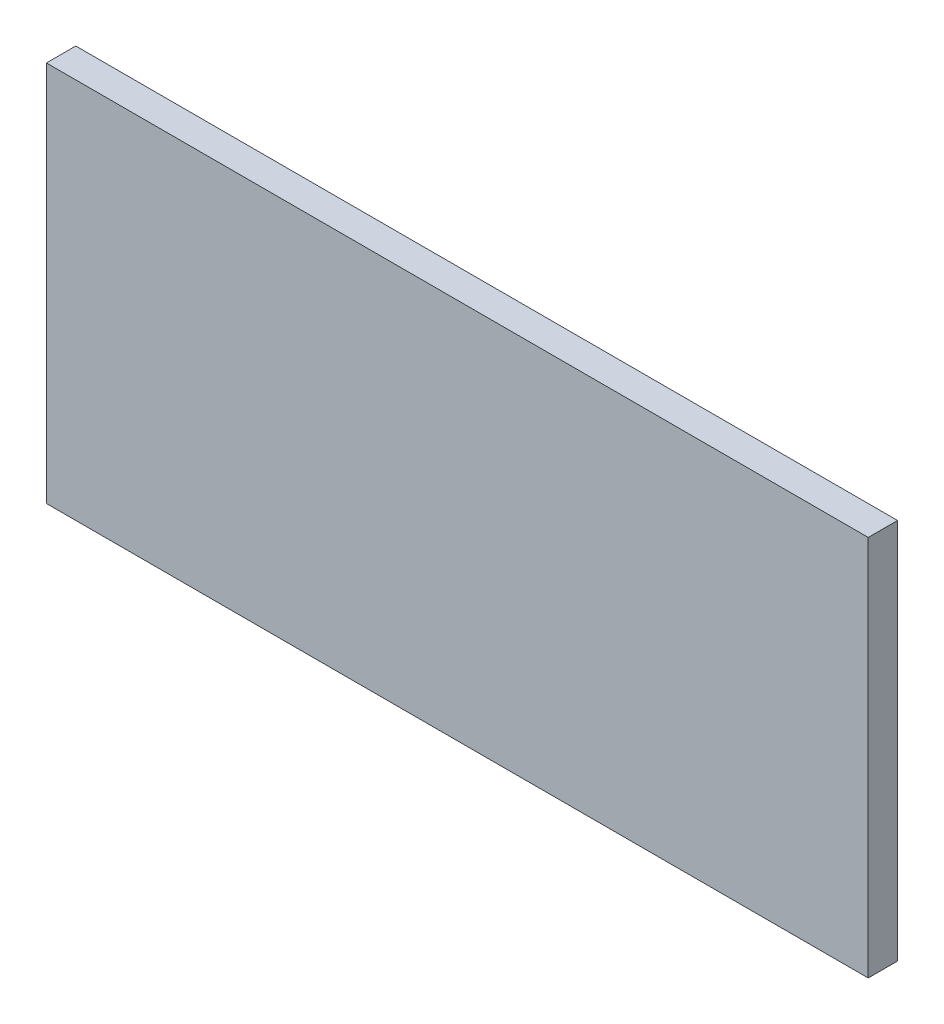
ISO-10303-21;
HEADER;
FILE_DESCRIPTION(('STEP AP214'),'2;1');
FILE_NAME('part.step','',(''),(''),'','','');
FILE_SCHEMA(('AUTOMOTIVE_DESIGN { 1 0 10303 214 1 1 1 1 }'));
ENDSEC;
DATA;
#1=APPLICATION_CONTEXT('core data for automotive mechanical design processes');
#2=APPLICATION_PROTOCOL_DEFINITION('international standard','automotive_design',2000,#1);
#3=PRODUCT_CONTEXT('',#1,'mechanical');
#4=PRODUCT('Part','Part','',(#3));
#5=PRODUCT_RELATED_PRODUCT_CATEGORY('part','',(#4));
#6=PRODUCT_DEFINITION_FORMATION('','',#4);
#7=PRODUCT_DEFINITION_CONTEXT('part definition',#1,'design');
#8=PRODUCT_DEFINITION('design','',#6,#7);
#9=PRODUCT_DEFINITION_SHAPE('','',#8);
#10=(LENGTH_UNIT() NAMED_UNIT(*) SI_UNIT(.MILLI.,.METRE.));
#11=(NAMED_UNIT(*) PLANE_ANGLE_UNIT() SI_UNIT($,.RADIAN.));
#12=(NAMED_UNIT(*) SI_UNIT($,.STERADIAN.) SOLID_ANGLE_UNIT());
#13=UNCERTAINTY_MEASURE_WITH_UNIT(LENGTH_MEASURE(1.E-05),#10,'distance_accuracy_value','');
#14=(GEOMETRIC_REPRESENTATION_CONTEXT(3) GLOBAL_UNCERTAINTY_ASSIGNED_CONTEXT((#13)) GLOBAL_UNIT_ASSIGNED_CONTEXT((#10,
#11,#12)) REPRESENTATION_CONTEXT('',''));
#15=CARTESIAN_POINT('',(0.,0.,0.));
#16=DIRECTION('',(0.,0.,1.));
#17=DIRECTION('',(1.,0.,0.));
#18=AXIS2_PLACEMENT_3D('',#15,#16,#17);
#19=CARTESIAN_POINT('',(-14.,6.,1.));
#20=DIRECTION('',(1.,0.,0.));
#21=DIRECTION('',(0.,1.,0.));
#22=AXIS2_PLACEMENT_3D('',#19,#20,#21);
#23=PLANE('',#22);
#24=DIRECTION('',(0.,-1.,0.));
#25=VECTOR('',#24,1.);
#26=CARTESIAN_POINT('',(-14.,6.,0.));
#27=LINE('',#26,#25);
#28=CARTESIAN_POINT('',(-14.,6.,0.));
#29=VERTEX_POINT('',#28);
#30=CARTESIAN_POINT('',(-14.,-7.,0.));
#31=VERTEX_POINT('',#30);
#32=EDGE_CURVE('E96',#29,#31,#27,.T.);
#33=ORIENTED_EDGE('',*,*,#32,.T.);
#34=DIRECTION('',(0.,0.,-1.));
#35=VECTOR('',#34,1.);
#36=CARTESIAN_POINT('',(-14.,-7.,1.));
#37=LINE('',#36,#35);
#38=CARTESIAN_POINT('',(-14.,-7.,1.));
#39=VERTEX_POINT('',#38);
#40=EDGE_CURVE('E11',#39,#31,#37,.T.);
#41=ORIENTED_EDGE('',*,*,#40,.F.);
#42=DIRECTION('',(0.,-1.,0.));
#43=VECTOR('',#42,1.);
#44=CARTESIAN_POINT('',(-14.,6.,1.));
#45=LINE('',#44,#43);
#46=CARTESIAN_POINT('',(-14.,6.,1.));
#47=VERTEX_POINT('',#46);
#48=EDGE_CURVE('E84',#47,#39,#45,.T.);
#49=ORIENTED_EDGE('',*,*,#48,.F.);
#50=DIRECTION('',(0.,0.,-1.));
#51=VECTOR('',#50,1.);
#52=CARTESIAN_POINT('',(-14.,6.,1.));
#53=LINE('',#52,#51);
#54=EDGE_CURVE('E92',#47,#29,#53,.T.);
#55=ORIENTED_EDGE('',*,*,#54,.T.);
#56=EDGE_LOOP('',(#33,#41,#49,#55));
#57=FACE_BOUND('',#56,.T.);
#58=ADVANCED_FACE('F33',(#57),#23,.F.);
#59=CARTESIAN_POINT('',(-14.,-7.,1.));
#60=DIRECTION('',(0.,1.,0.));
#61=DIRECTION('',(0.,0.,1.));
#62=AXIS2_PLACEMENT_3D('',#59,#60,#61);
#63=PLANE('',#62);
#64=DIRECTION('',(1.,0.,0.));
#65=VECTOR('',#64,1.);
#66=CARTESIAN_POINT('',(-14.,-7.,0.));
#67=LINE('',#66,#65);
#68=CARTESIAN_POINT('',(14.,-7.,0.));
#69=VERTEX_POINT('',#68);
#70=EDGE_CURVE('E88',#31,#69,#67,.T.);
#71=ORIENTED_EDGE('',*,*,#70,.T.);
#72=DIRECTION('',(0.,0.,-1.));
#73=VECTOR('',#72,1.);
#74=CARTESIAN_POINT('',(14.,-7.,1.));
#75=LINE('',#74,#73);
#76=CARTESIAN_POINT('',(14.,-7.,1.));
#77=VERTEX_POINT('',#76);
#78=EDGE_CURVE('E41',#77,#69,#75,.T.);
#79=ORIENTED_EDGE('',*,*,#78,.F.);
#80=DIRECTION('',(1.,0.,0.));
#81=VECTOR('',#80,1.);
#82=CARTESIAN_POINT('',(-14.,-7.,1.));
#83=LINE('',#82,#81);
#84=EDGE_CURVE('E79',#39,#77,#83,.T.);
#85=ORIENTED_EDGE('',*,*,#84,.F.);
#86=ORIENTED_EDGE('',*,*,#40,.T.);
#87=EDGE_LOOP('',(#71,#79,#85,#86));
#88=FACE_BOUND('',#87,.T.);
#89=ADVANCED_FACE('F87',(#88),#63,.F.);
#90=CARTESIAN_POINT('',(14.,6.,1.));
#91=DIRECTION('',(-1.,0.,0.));
#92=DIRECTION('',(0.,-1.,0.));
#93=AXIS2_PLACEMENT_3D('',#90,#91,#92);
#94=PLANE('',#93);
#95=DIRECTION('',(0.,1.,0.));
#96=VECTOR('',#95,1.);
#97=CARTESIAN_POINT('',(14.,6.,0.));
#98=LINE('',#97,#96);
#99=CARTESIAN_POINT('',(14.,6.,0.));
#100=VERTEX_POINT('',#99);
#101=EDGE_CURVE('E66',#69,#100,#98,.T.);
#102=ORIENTED_EDGE('',*,*,#101,.T.);
#103=DIRECTION('',(0.,0.,-1.));
#104=VECTOR('',#103,1.);
#105=CARTESIAN_POINT('',(14.,6.,1.));
#106=LINE('',#105,#104);
#107=CARTESIAN_POINT('',(14.,6.,1.));
#108=VERTEX_POINT('',#107);
#109=EDGE_CURVE('E89',#108,#100,#106,.T.);
#110=ORIENTED_EDGE('',*,*,#109,.F.);
#111=DIRECTION('',(0.,1.,0.));
#112=VECTOR('',#111,1.);
#113=CARTESIAN_POINT('',(14.,6.,1.));
#114=LINE('',#113,#112);
#115=EDGE_CURVE('E82',#77,#108,#114,.T.);
#116=ORIENTED_EDGE('',*,*,#115,.F.);
#117=ORIENTED_EDGE('',*,*,#78,.T.);
#118=EDGE_LOOP('',(#102,#110,#116,#117));
#119=FACE_BOUND('',#118,.T.);
#120=ADVANCED_FACE('F90',(#119),#94,.F.);
#121=CARTESIAN_POINT('',(-14.,6.,1.));
#122=DIRECTION('',(0.,-1.,0.));
#123=DIRECTION('',(0.,0.,-1.));
#124=AXIS2_PLACEMENT_3D('',#121,#122,#123);
#125=PLANE('',#124);
#126=DIRECTION('',(-1.,0.,0.));
#127=VECTOR('',#126,1.);
#128=CARTESIAN_POINT('',(-14.,6.,0.));
#129=LINE('',#128,#127);
#130=EDGE_CURVE('E72',#100,#29,#129,.T.);
#131=ORIENTED_EDGE('',*,*,#130,.T.);
#132=ORIENTED_EDGE('',*,*,#54,.F.);
#133=DIRECTION('',(-1.,0.,0.));
#134=VECTOR('',#133,1.);
#135=CARTESIAN_POINT('',(-14.,6.,1.));
#136=LINE('',#135,#134);
#137=EDGE_CURVE('E49',#108,#47,#136,.T.);
#138=ORIENTED_EDGE('',*,*,#137,.F.);
#139=ORIENTED_EDGE('',*,*,#109,.T.);
#140=EDGE_LOOP('',(#131,#132,#138,#139));
#141=FACE_BOUND('',#140,.T.);
#142=ADVANCED_FACE('F103',(#141),#125,.F.);
#143=CARTESIAN_POINT('',(0.,0.,1.));
#144=DIRECTION('',(0.,0.,1.));
#145=DIRECTION('',(1.,0.,0.));
#146=AXIS2_PLACEMENT_3D('',#143,#144,#145);
#147=PLANE('',#146);
#148=ORIENTED_EDGE('',*,*,#48,.T.);
#149=ORIENTED_EDGE('',*,*,#84,.T.);
#150=ORIENTED_EDGE('',*,*,#115,.T.);
#151=ORIENTED_EDGE('',*,*,#137,.T.);
#152=EDGE_LOOP('',(#148,#149,#150,#151));
#153=FACE_BOUND('',#152,.T.);
#154=ADVANCED_FACE('F80',(#153),#147,.T.);
#155=CARTESIAN_POINT('',(0.,0.,0.));
#156=DIRECTION('',(0.,0.,1.));
#157=DIRECTION('',(1.,0.,0.));
#158=AXIS2_PLACEMENT_3D('',#155,#156,#157);
#159=PLANE('',#158);
#160=ORIENTED_EDGE('',*,*,#32,.F.);
#161=ORIENTED_EDGE('',*,*,#130,.F.);
#162=ORIENTED_EDGE('',*,*,#101,.F.);
#163=ORIENTED_EDGE('',*,*,#70,.F.);
#164=EDGE_LOOP('',(#160,#161,#162,#163));
#165=FACE_BOUND('',#164,.T.);
#166=ADVANCED_FACE('F106',(#165),#159,.F.);
#167=CLOSED_SHELL('',(#58,#89,#120,#142,#154,#166));
#168=MANIFOLD_SOLID_BREP('B2',#167);
#169=ADVANCED_BREP_SHAPE_REPRESENTATION('',(#18,#168),#14);
#170=SHAPE_DEFINITION_REPRESENTATION(#9,#169);
ENDSEC;
END-ISO-10303-21;
